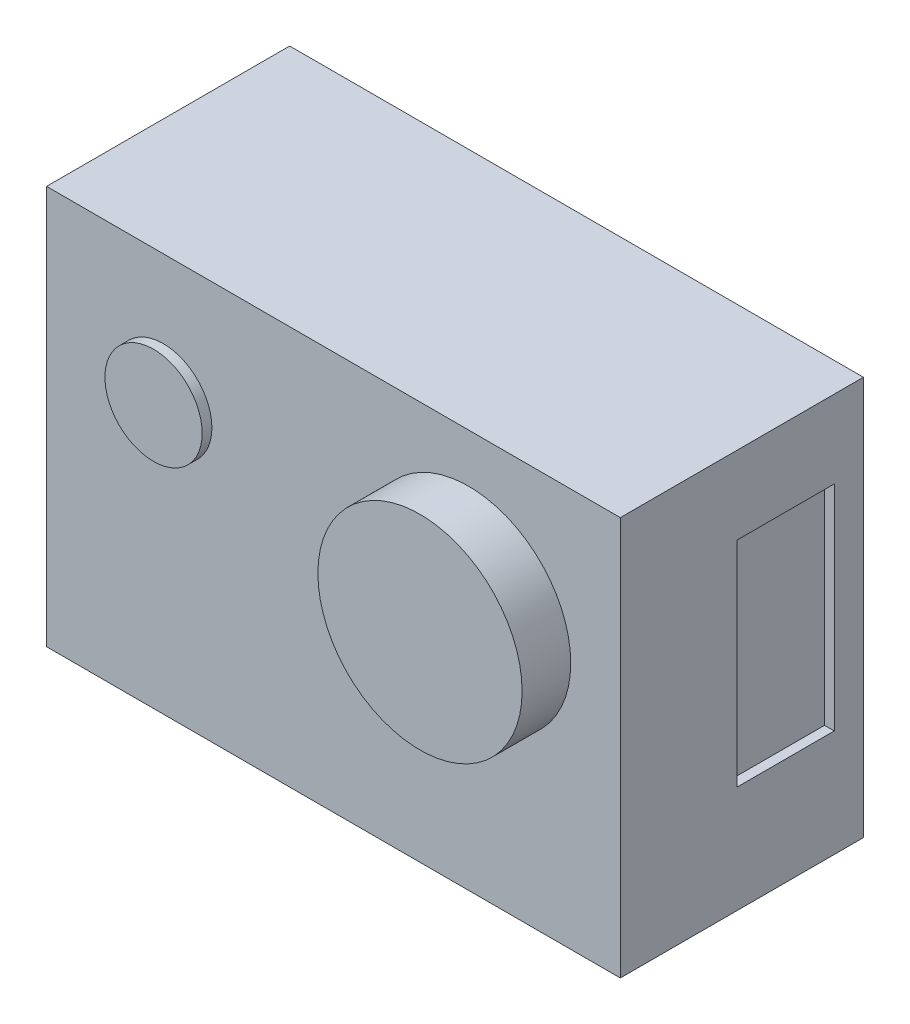
ISO-10303-21;
HEADER;
FILE_DESCRIPTION(('STEP AP214'),'2;1');
FILE_NAME('part.step','',(''),(''),'','','');
FILE_SCHEMA(('AUTOMOTIVE_DESIGN { 1 0 10303 214 1 1 1 1 }'));
ENDSEC;
DATA;
#1=APPLICATION_CONTEXT('core data for automotive mechanical design processes');
#2=APPLICATION_PROTOCOL_DEFINITION('international standard','automotive_design',2000,#1);
#3=PRODUCT_CONTEXT('',#1,'mechanical');
#4=PRODUCT('Part','Part','',(#3));
#5=PRODUCT_RELATED_PRODUCT_CATEGORY('part','',(#4));
#6=PRODUCT_DEFINITION_FORMATION('','',#4);
#7=PRODUCT_DEFINITION_CONTEXT('part definition',#1,'design');
#8=PRODUCT_DEFINITION('design','',#6,#7);
#9=PRODUCT_DEFINITION_SHAPE('','',#8);
#10=(LENGTH_UNIT() NAMED_UNIT(*) SI_UNIT(.MILLI.,.METRE.));
#11=(NAMED_UNIT(*) PLANE_ANGLE_UNIT() SI_UNIT($,.RADIAN.));
#12=(NAMED_UNIT(*) SI_UNIT($,.STERADIAN.) SOLID_ANGLE_UNIT());
#13=UNCERTAINTY_MEASURE_WITH_UNIT(LENGTH_MEASURE(1.E-05),#10,'distance_accuracy_value','');
#14=(GEOMETRIC_REPRESENTATION_CONTEXT(3) GLOBAL_UNCERTAINTY_ASSIGNED_CONTEXT((#13)) GLOBAL_UNIT_ASSIGNED_CONTEXT((#10,
#11,#12)) REPRESENTATION_CONTEXT('',''));
#15=CARTESIAN_POINT('',(0.,0.,0.));
#16=DIRECTION('',(0.,0.,1.));
#17=DIRECTION('',(1.,0.,0.));
#18=AXIS2_PLACEMENT_3D('',#15,#16,#17);
#19=CARTESIAN_POINT('',(-29.5,20.4999999999999,25.));
#20=DIRECTION('',(1.,0.,0.));
#21=DIRECTION('',(0.,1.,0.));
#22=AXIS2_PLACEMENT_3D('',#19,#20,#21);
#23=PLANE('',#22);
#24=DIRECTION('',(0.,-1.,0.));
#25=VECTOR('',#24,1.);
#26=CARTESIAN_POINT('',(-29.5,20.4999999999999,0.));
#27=LINE('',#26,#25);
#28=CARTESIAN_POINT('',(-29.5,20.4999999999999,0.));
#29=VERTEX_POINT('',#28);
#30=CARTESIAN_POINT('',(-29.5,-20.5,0.));
#31=VERTEX_POINT('',#30);
#32=EDGE_CURVE('E179',#29,#31,#27,.T.);
#33=ORIENTED_EDGE('',*,*,#32,.T.);
#34=DIRECTION('',(0.,0.,-1.));
#35=VECTOR('',#34,1.);
#36=CARTESIAN_POINT('',(-29.5,-20.5,25.));
#37=LINE('',#36,#35);
#38=CARTESIAN_POINT('',(-29.5,-20.5,25.));
#39=VERTEX_POINT('',#38);
#40=EDGE_CURVE('E47',#39,#31,#37,.T.);
#41=ORIENTED_EDGE('',*,*,#40,.F.);
#42=DIRECTION('',(0.,-1.,0.));
#43=VECTOR('',#42,1.);
#44=CARTESIAN_POINT('',(-29.5,20.4999999999999,25.));
#45=LINE('',#44,#43);
#46=CARTESIAN_POINT('',(-29.5,20.4999999999999,25.));
#47=VERTEX_POINT('',#46);
#48=EDGE_CURVE('E181',#47,#39,#45,.T.);
#49=ORIENTED_EDGE('',*,*,#48,.F.);
#50=DIRECTION('',(0.,0.,-1.));
#51=VECTOR('',#50,1.);
#52=CARTESIAN_POINT('',(-29.5,20.4999999999999,25.));
#53=LINE('',#52,#51);
#54=EDGE_CURVE('E69',#47,#29,#53,.T.);
#55=ORIENTED_EDGE('',*,*,#54,.T.);
#56=EDGE_LOOP('',(#33,#41,#49,#55));
#57=FACE_BOUND('',#56,.T.);
#58=ADVANCED_FACE('F44',(#57),#23,.F.);
#59=CARTESIAN_POINT('',(-29.5,-20.5,25.));
#60=DIRECTION('',(0.,1.,0.));
#61=DIRECTION('',(0.,0.,1.));
#62=AXIS2_PLACEMENT_3D('',#59,#60,#61);
#63=PLANE('',#62);
#64=DIRECTION('',(1.,0.,0.));
#65=VECTOR('',#64,1.);
#66=CARTESIAN_POINT('',(-29.5,-20.5,0.));
#67=LINE('',#66,#65);
#68=CARTESIAN_POINT('',(29.5,-20.5,0.));
#69=VERTEX_POINT('',#68);
#70=EDGE_CURVE('E196',#31,#69,#67,.T.);
#71=ORIENTED_EDGE('',*,*,#70,.T.);
#72=DIRECTION('',(0.,0.,-1.));
#73=VECTOR('',#72,1.);
#74=CARTESIAN_POINT('',(29.5,-20.5,25.));
#75=LINE('',#74,#73);
#76=CARTESIAN_POINT('',(29.5,-20.5,25.));
#77=VERTEX_POINT('',#76);
#78=EDGE_CURVE('E211',#77,#69,#75,.T.);
#79=ORIENTED_EDGE('',*,*,#78,.F.);
#80=DIRECTION('',(1.,0.,0.));
#81=VECTOR('',#80,1.);
#82=CARTESIAN_POINT('',(-29.5,-20.5,25.));
#83=LINE('',#82,#81);
#84=EDGE_CURVE('E96',#39,#77,#83,.T.);
#85=ORIENTED_EDGE('',*,*,#84,.F.);
#86=ORIENTED_EDGE('',*,*,#40,.T.);
#87=EDGE_LOOP('',(#71,#79,#85,#86));
#88=FACE_BOUND('',#87,.T.);
#89=ADVANCED_FACE('F217',(#88),#63,.F.);
#90=CARTESIAN_POINT('',(29.5,20.4999999999999,25.));
#91=DIRECTION('',(1.,0.,0.));
#92=DIRECTION('',(0.,1.,0.));
#93=AXIS2_PLACEMENT_3D('',#90,#91,#92);
#94=PLANE('',#93);
#95=DIRECTION('',(0.,-1.,0.));
#96=VECTOR('',#95,1.);
#97=CARTESIAN_POINT('',(29.5,12.4999999999999,13.));
#98=LINE('',#97,#96);
#99=CARTESIAN_POINT('',(29.5,12.4999999999999,13.));
#100=VERTEX_POINT('',#99);
#101=CARTESIAN_POINT('',(29.5,-9.50000000000005,13.));
#102=VERTEX_POINT('',#101);
#103=EDGE_CURVE('E60',#100,#102,#98,.T.);
#104=ORIENTED_EDGE('',*,*,#103,.F.);
#105=DIRECTION('',(0.,0.,-1.));
#106=VECTOR('',#105,1.);
#107=CARTESIAN_POINT('',(29.5,12.4999999999999,13.));
#108=LINE('',#107,#106);
#109=CARTESIAN_POINT('',(29.5,12.4999999999999,3.));
#110=VERTEX_POINT('',#109);
#111=EDGE_CURVE('E141',#100,#110,#108,.T.);
#112=ORIENTED_EDGE('',*,*,#111,.T.);
#113=DIRECTION('',(0.,-1.,0.));
#114=VECTOR('',#113,1.);
#115=CARTESIAN_POINT('',(29.5,12.4999999999999,3.));
#116=LINE('',#115,#114);
#117=CARTESIAN_POINT('',(29.5,-9.50000000000005,3.));
#118=VERTEX_POINT('',#117);
#119=EDGE_CURVE('E145',#110,#118,#116,.T.);
#120=ORIENTED_EDGE('',*,*,#119,.T.);
#121=DIRECTION('',(0.,0.,-1.));
#122=VECTOR('',#121,1.);
#123=CARTESIAN_POINT('',(29.5,-9.50000000000005,13.));
#124=LINE('',#123,#122);
#125=EDGE_CURVE('E154',#102,#118,#124,.T.);
#126=ORIENTED_EDGE('',*,*,#125,.F.);
#127=EDGE_LOOP('',(#104,#112,#120,#126));
#128=FACE_BOUND('',#127,.T.);
#129=DIRECTION('',(0.,-1.,0.));
#130=VECTOR('',#129,1.);
#131=CARTESIAN_POINT('',(29.5,20.4999999999999,0.));
#132=LINE('',#131,#130);
#133=CARTESIAN_POINT('',(29.5,20.4999999999999,0.));
#134=VERTEX_POINT('',#133);
#135=EDGE_CURVE('E200',#134,#69,#132,.T.);
#136=ORIENTED_EDGE('',*,*,#135,.F.);
#137=DIRECTION('',(0.,0.,-1.));
#138=VECTOR('',#137,1.);
#139=CARTESIAN_POINT('',(29.5,20.4999999999999,25.));
#140=LINE('',#139,#138);
#141=CARTESIAN_POINT('',(29.5,20.4999999999999,25.));
#142=VERTEX_POINT('',#141);
#143=EDGE_CURVE('E209',#142,#134,#140,.T.);
#144=ORIENTED_EDGE('',*,*,#143,.F.);
#145=DIRECTION('',(0.,-1.,0.));
#146=VECTOR('',#145,1.);
#147=CARTESIAN_POINT('',(29.5,20.4999999999999,25.));
#148=LINE('',#147,#146);
#149=EDGE_CURVE('E187',#142,#77,#148,.T.);
#150=ORIENTED_EDGE('',*,*,#149,.T.);
#151=ORIENTED_EDGE('',*,*,#78,.T.);
#152=EDGE_LOOP('',(#136,#144,#150,#151));
#153=FACE_BOUND('',#152,.T.);
#154=ADVANCED_FACE('F223',(#128,#153),#94,.T.);
#155=CARTESIAN_POINT('',(-29.5,20.4999999999999,25.));
#156=DIRECTION('',(0.,1.,0.));
#157=DIRECTION('',(0.,0.,1.));
#158=AXIS2_PLACEMENT_3D('',#155,#156,#157);
#159=PLANE('',#158);
#160=DIRECTION('',(1.,0.,0.));
#161=VECTOR('',#160,1.);
#162=CARTESIAN_POINT('',(-29.5,20.4999999999999,0.));
#163=LINE('',#162,#161);
#164=EDGE_CURVE('E184',#29,#134,#163,.T.);
#165=ORIENTED_EDGE('',*,*,#164,.F.);
#166=ORIENTED_EDGE('',*,*,#54,.F.);
#167=DIRECTION('',(1.,0.,0.));
#168=VECTOR('',#167,1.);
#169=CARTESIAN_POINT('',(-29.5,20.4999999999999,25.));
#170=LINE('',#169,#168);
#171=EDGE_CURVE('E191',#47,#142,#170,.T.);
#172=ORIENTED_EDGE('',*,*,#171,.T.);
#173=ORIENTED_EDGE('',*,*,#143,.T.);
#174=EDGE_LOOP('',(#165,#166,#172,#173));
#175=FACE_BOUND('',#174,.T.);
#176=ADVANCED_FACE('F220',(#175),#159,.T.);
#177=CARTESIAN_POINT('',(0.,0.,25.));
#178=DIRECTION('',(0.,0.,1.));
#179=DIRECTION('',(1.,0.,0.));
#180=AXIS2_PLACEMENT_3D('',#177,#178,#179);
#181=PLANE('',#180);
#182=CARTESIAN_POINT('',(-17.5,7.49999999999992,25.));
#183=DIRECTION('',(0.,0.,1.));
#184=DIRECTION('',(1.,0.,0.));
#185=AXIS2_PLACEMENT_3D('',#182,#183,#184);
#186=CIRCLE('',#185,4.99999999999999);
#187=CARTESIAN_POINT('',(-12.5,7.49999999999992,25.));
#188=VERTEX_POINT('',#187);
#189=EDGE_CURVE('E163',#188,#188,#186,.T.);
#190=ORIENTED_EDGE('',*,*,#189,.F.);
#191=EDGE_LOOP('',(#190));
#192=FACE_BOUND('',#191,.T.);
#193=CARTESIAN_POINT('',(13.9,4.99999999999995,25.));
#194=DIRECTION('',(0.,0.,1.));
#195=DIRECTION('',(1.,0.,0.));
#196=AXIS2_PLACEMENT_3D('',#193,#194,#195);
#197=CIRCLE('',#196,10.5);
#198=CARTESIAN_POINT('',(24.4,4.99999999999995,25.));
#199=VERTEX_POINT('',#198);
#200=EDGE_CURVE('E11',#199,#199,#197,.T.);
#201=ORIENTED_EDGE('',*,*,#200,.F.);
#202=EDGE_LOOP('',(#201));
#203=FACE_BOUND('',#202,.T.);
#204=ORIENTED_EDGE('',*,*,#48,.T.);
#205=ORIENTED_EDGE('',*,*,#84,.T.);
#206=ORIENTED_EDGE('',*,*,#149,.F.);
#207=ORIENTED_EDGE('',*,*,#171,.F.);
#208=EDGE_LOOP('',(#204,#205,#206,#207));
#209=FACE_BOUND('',#208,.T.);
#210=ADVANCED_FACE('F232',(#192,#203,#209),#181,.T.);
#211=CARTESIAN_POINT('',(0.,0.,0.));
#212=DIRECTION('',(0.,0.,1.));
#213=DIRECTION('',(1.,0.,0.));
#214=AXIS2_PLACEMENT_3D('',#211,#212,#213);
#215=PLANE('',#214);
#216=ORIENTED_EDGE('',*,*,#32,.F.);
#217=ORIENTED_EDGE('',*,*,#164,.T.);
#218=ORIENTED_EDGE('',*,*,#135,.T.);
#219=ORIENTED_EDGE('',*,*,#70,.F.);
#220=EDGE_LOOP('',(#216,#217,#218,#219));
#221=FACE_BOUND('',#220,.T.);
#222=ADVANCED_FACE('F219',(#221),#215,.F.);
#223=CARTESIAN_POINT('',(13.9,4.99999999999995,30.));
#224=DIRECTION('',(0.,0.,-1.));
#225=DIRECTION('',(-1.,0.,0.));
#226=AXIS2_PLACEMENT_3D('',#223,#224,#225);
#227=CYLINDRICAL_SURFACE('',#226,10.5);
#228=CARTESIAN_POINT('',(13.9,4.99999999999995,30.));
#229=DIRECTION('',(0.,0.,1.));
#230=DIRECTION('',(1.,0.,0.));
#231=AXIS2_PLACEMENT_3D('',#228,#229,#230);
#232=CIRCLE('',#231,10.5);
#233=CARTESIAN_POINT('',(24.4,4.99999999999995,30.));
#234=VERTEX_POINT('',#233);
#235=EDGE_CURVE('E173',#234,#234,#232,.T.);
#236=ORIENTED_EDGE('',*,*,#235,.F.);
#237=EDGE_LOOP('',(#236));
#238=FACE_BOUND('',#237,.T.);
#239=ORIENTED_EDGE('',*,*,#200,.T.);
#240=EDGE_LOOP('',(#239));
#241=FACE_BOUND('',#240,.T.);
#242=ADVANCED_FACE('F266',(#238,#241),#227,.T.);
#243=CARTESIAN_POINT('',(0.,0.,30.));
#244=DIRECTION('',(0.,0.,1.));
#245=DIRECTION('',(1.,0.,0.));
#246=AXIS2_PLACEMENT_3D('',#243,#244,#245);
#247=PLANE('',#246);
#248=ORIENTED_EDGE('',*,*,#235,.T.);
#249=EDGE_LOOP('',(#248));
#250=FACE_BOUND('',#249,.T.);
#251=ADVANCED_FACE('F273',(#250),#247,.T.);
#252=CARTESIAN_POINT('',(-17.5,7.49999999999992,26.));
#253=DIRECTION('',(0.,0.,-1.));
#254=DIRECTION('',(-1.,0.,0.));
#255=AXIS2_PLACEMENT_3D('',#252,#253,#254);
#256=CYLINDRICAL_SURFACE('',#255,4.99999999999999);
#257=CARTESIAN_POINT('',(-17.5,7.49999999999992,26.));
#258=DIRECTION('',(0.,0.,1.));
#259=DIRECTION('',(1.,0.,0.));
#260=AXIS2_PLACEMENT_3D('',#257,#258,#259);
#261=CIRCLE('',#260,4.99999999999999);
#262=CARTESIAN_POINT('',(-12.5,7.49999999999992,26.));
#263=VERTEX_POINT('',#262);
#264=EDGE_CURVE('E169',#263,#263,#261,.T.);
#265=ORIENTED_EDGE('',*,*,#264,.F.);
#266=EDGE_LOOP('',(#265));
#267=FACE_BOUND('',#266,.T.);
#268=ORIENTED_EDGE('',*,*,#189,.T.);
#269=EDGE_LOOP('',(#268));
#270=FACE_BOUND('',#269,.T.);
#271=ADVANCED_FACE('F280',(#267,#270),#256,.T.);
#272=CARTESIAN_POINT('',(-17.5,7.49999999999992,26.));
#273=DIRECTION('',(0.,0.,1.));
#274=DIRECTION('',(1.,0.,0.));
#275=AXIS2_PLACEMENT_3D('',#272,#273,#274);
#276=PLANE('',#275);
#277=ORIENTED_EDGE('',*,*,#264,.T.);
#278=EDGE_LOOP('',(#277));
#279=FACE_BOUND('',#278,.T.);
#280=ADVANCED_FACE('F287',(#279),#276,.T.);
#281=CARTESIAN_POINT('',(28.5,12.4999999999999,13.));
#282=DIRECTION('',(0.,0.,1.));
#283=DIRECTION('',(0.,-1.,0.));
#284=AXIS2_PLACEMENT_3D('',#281,#282,#283);
#285=PLANE('',#284);
#286=ORIENTED_EDGE('',*,*,#103,.T.);
#287=DIRECTION('',(1.,0.,0.));
#288=VECTOR('',#287,1.);
#289=CARTESIAN_POINT('',(28.5,-9.50000000000005,13.));
#290=LINE('',#289,#288);
#291=CARTESIAN_POINT('',(28.5,-9.50000000000005,13.));
#292=VERTEX_POINT('',#291);
#293=EDGE_CURVE('E117',#292,#102,#290,.T.);
#294=ORIENTED_EDGE('',*,*,#293,.F.);
#295=DIRECTION('',(0.,-1.,0.));
#296=VECTOR('',#295,1.);
#297=CARTESIAN_POINT('',(28.5,12.4999999999999,13.));
#298=LINE('',#297,#296);
#299=CARTESIAN_POINT('',(28.5,12.4999999999999,13.));
#300=VERTEX_POINT('',#299);
#301=EDGE_CURVE('E121',#300,#292,#298,.T.);
#302=ORIENTED_EDGE('',*,*,#301,.F.);
#303=DIRECTION('',(1.,0.,0.));
#304=VECTOR('',#303,1.);
#305=CARTESIAN_POINT('',(28.5,12.4999999999999,13.));
#306=LINE('',#305,#304);
#307=EDGE_CURVE('E160',#300,#100,#306,.T.);
#308=ORIENTED_EDGE('',*,*,#307,.T.);
#309=EDGE_LOOP('',(#286,#294,#302,#308));
#310=FACE_BOUND('',#309,.T.);
#311=ADVANCED_FACE('F119',(#310),#285,.F.);
#312=CARTESIAN_POINT('',(28.5,12.4999999999999,13.));
#313=DIRECTION('',(0.,-1.,0.));
#314=DIRECTION('',(1.,0.,0.));
#315=AXIS2_PLACEMENT_3D('',#312,#313,#314);
#316=PLANE('',#315);
#317=ORIENTED_EDGE('',*,*,#111,.F.);
#318=ORIENTED_EDGE('',*,*,#307,.F.);
#319=DIRECTION('',(0.,0.,-1.));
#320=VECTOR('',#319,1.);
#321=CARTESIAN_POINT('',(28.5,12.4999999999999,13.));
#322=LINE('',#321,#320);
#323=CARTESIAN_POINT('',(28.5,12.4999999999999,3.));
#324=VERTEX_POINT('',#323);
#325=EDGE_CURVE('E127',#300,#324,#322,.T.);
#326=ORIENTED_EDGE('',*,*,#325,.T.);
#327=DIRECTION('',(1.,0.,0.));
#328=VECTOR('',#327,1.);
#329=CARTESIAN_POINT('',(28.5,12.4999999999999,3.));
#330=LINE('',#329,#328);
#331=EDGE_CURVE('E164',#324,#110,#330,.T.);
#332=ORIENTED_EDGE('',*,*,#331,.T.);
#333=EDGE_LOOP('',(#317,#318,#326,#332));
#334=FACE_BOUND('',#333,.T.);
#335=ADVANCED_FACE('F300',(#334),#316,.T.);
#336=CARTESIAN_POINT('',(28.5,12.4999999999999,3.));
#337=DIRECTION('',(0.,0.,1.));
#338=DIRECTION('',(0.,-1.,0.));
#339=AXIS2_PLACEMENT_3D('',#336,#337,#338);
#340=PLANE('',#339);
#341=ORIENTED_EDGE('',*,*,#119,.F.);
#342=ORIENTED_EDGE('',*,*,#331,.F.);
#343=DIRECTION('',(0.,-1.,0.));
#344=VECTOR('',#343,1.);
#345=CARTESIAN_POINT('',(28.5,12.4999999999999,3.));
#346=LINE('',#345,#344);
#347=CARTESIAN_POINT('',(28.5,-9.50000000000005,3.));
#348=VERTEX_POINT('',#347);
#349=EDGE_CURVE('E136',#324,#348,#346,.T.);
#350=ORIENTED_EDGE('',*,*,#349,.T.);
#351=DIRECTION('',(1.,0.,0.));
#352=VECTOR('',#351,1.);
#353=CARTESIAN_POINT('',(28.5,-9.50000000000005,3.));
#354=LINE('',#353,#352);
#355=EDGE_CURVE('E126',#348,#118,#354,.T.);
#356=ORIENTED_EDGE('',*,*,#355,.T.);
#357=EDGE_LOOP('',(#341,#342,#350,#356));
#358=FACE_BOUND('',#357,.T.);
#359=ADVANCED_FACE('F307',(#358),#340,.T.);
#360=CARTESIAN_POINT('',(28.5,-9.50000000000005,13.));
#361=DIRECTION('',(0.,-1.,0.));
#362=DIRECTION('',(1.,0.,0.));
#363=AXIS2_PLACEMENT_3D('',#360,#361,#362);
#364=PLANE('',#363);
#365=ORIENTED_EDGE('',*,*,#125,.T.);
#366=ORIENTED_EDGE('',*,*,#355,.F.);
#367=DIRECTION('',(0.,0.,-1.));
#368=VECTOR('',#367,1.);
#369=CARTESIAN_POINT('',(28.5,-9.50000000000005,13.));
#370=LINE('',#369,#368);
#371=EDGE_CURVE('E131',#292,#348,#370,.T.);
#372=ORIENTED_EDGE('',*,*,#371,.F.);
#373=ORIENTED_EDGE('',*,*,#293,.T.);
#374=EDGE_LOOP('',(#365,#366,#372,#373));
#375=FACE_BOUND('',#374,.T.);
#376=ADVANCED_FACE('F132',(#375),#364,.F.);
#377=CARTESIAN_POINT('',(28.5,0.,0.));
#378=DIRECTION('',(1.,0.,0.));
#379=DIRECTION('',(0.,0.,-1.));
#380=AXIS2_PLACEMENT_3D('',#377,#378,#379);
#381=PLANE('',#380);
#382=ORIENTED_EDGE('',*,*,#301,.T.);
#383=ORIENTED_EDGE('',*,*,#371,.T.);
#384=ORIENTED_EDGE('',*,*,#349,.F.);
#385=ORIENTED_EDGE('',*,*,#325,.F.);
#386=EDGE_LOOP('',(#382,#383,#384,#385));
#387=FACE_BOUND('',#386,.T.);
#388=ADVANCED_FACE('F139',(#387),#381,.T.);
#389=CLOSED_SHELL('',(#58,#89,#154,#176,#210,#222,#242,#251,#271,#280,#311,#335,#359,#376,#388));
#390=MANIFOLD_SOLID_BREP('B2',#389);
#391=ADVANCED_BREP_SHAPE_REPRESENTATION('',(#18,#390),#14);
#392=SHAPE_DEFINITION_REPRESENTATION(#9,#391);
ENDSEC;
END-ISO-10303-21;
